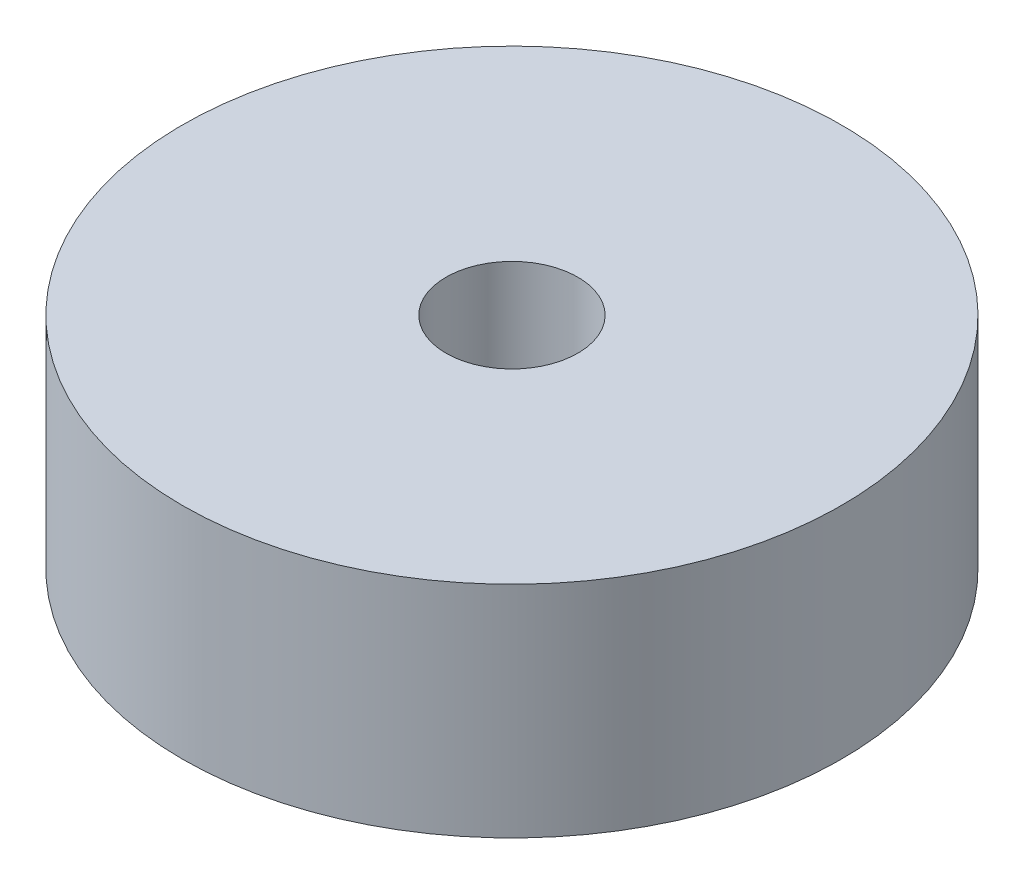
ISO-10303-21;
HEADER;
FILE_DESCRIPTION(('STEP AP214'),'2;1');
FILE_NAME('part.step','',(''),(''),'','','');
FILE_SCHEMA(('AUTOMOTIVE_DESIGN { 1 0 10303 214 1 1 1 1 }'));
ENDSEC;
DATA;
#1=APPLICATION_CONTEXT('core data for automotive mechanical design processes');
#2=APPLICATION_PROTOCOL_DEFINITION('international standard','automotive_design',2000,#1);
#3=PRODUCT_CONTEXT('',#1,'mechanical');
#4=PRODUCT('Part','Part','',(#3));
#5=PRODUCT_RELATED_PRODUCT_CATEGORY('part','',(#4));
#6=PRODUCT_DEFINITION_FORMATION('','',#4);
#7=PRODUCT_DEFINITION_CONTEXT('part definition',#1,'design');
#8=PRODUCT_DEFINITION('design','',#6,#7);
#9=PRODUCT_DEFINITION_SHAPE('','',#8);
#10=(LENGTH_UNIT() NAMED_UNIT(*) SI_UNIT(.MILLI.,.METRE.));
#11=(NAMED_UNIT(*) PLANE_ANGLE_UNIT() SI_UNIT($,.RADIAN.));
#12=(NAMED_UNIT(*) SI_UNIT($,.STERADIAN.) SOLID_ANGLE_UNIT());
#13=UNCERTAINTY_MEASURE_WITH_UNIT(LENGTH_MEASURE(1.E-05),#10,'distance_accuracy_value','');
#14=(GEOMETRIC_REPRESENTATION_CONTEXT(3) GLOBAL_UNCERTAINTY_ASSIGNED_CONTEXT((#13)) GLOBAL_UNIT_ASSIGNED_CONTEXT((#10,
#11,#12)) REPRESENTATION_CONTEXT('',''));
#15=CARTESIAN_POINT('',(0.,0.,0.));
#16=DIRECTION('',(0.,0.,1.));
#17=DIRECTION('',(1.,0.,0.));
#18=AXIS2_PLACEMENT_3D('',#15,#16,#17);
#19=CARTESIAN_POINT('',(0.,10.,0.));
#20=DIRECTION('',(0.,1.,0.));
#21=DIRECTION('',(0.,0.,1.));
#22=AXIS2_PLACEMENT_3D('',#19,#20,#21);
#23=PLANE('',#22);
#24=CARTESIAN_POINT('',(0.,10.,0.));
#25=DIRECTION('',(0.,1.,0.));
#26=DIRECTION('',(0.,0.,1.));
#27=AXIS2_PLACEMENT_3D('',#24,#25,#26);
#28=CIRCLE('',#27,15.);
#29=CARTESIAN_POINT('',(0.,10.,15.));
#30=VERTEX_POINT('',#29);
#31=EDGE_CURVE('E10',#30,#30,#28,.T.);
#32=ORIENTED_EDGE('',*,*,#31,.T.);
#33=EDGE_LOOP('',(#32));
#34=FACE_BOUND('',#33,.T.);
#35=CARTESIAN_POINT('',(0.,10.,0.));
#36=DIRECTION('',(0.,1.,0.));
#37=DIRECTION('',(0.,0.,1.));
#38=AXIS2_PLACEMENT_3D('',#35,#36,#37);
#39=CIRCLE('',#38,3.);
#40=CARTESIAN_POINT('',(0.,10.,3.));
#41=VERTEX_POINT('',#40);
#42=EDGE_CURVE('E41',#41,#41,#39,.T.);
#43=ORIENTED_EDGE('',*,*,#42,.F.);
#44=EDGE_LOOP('',(#43));
#45=FACE_BOUND('',#44,.T.);
#46=ADVANCED_FACE('F30',(#34,#45),#23,.T.);
#47=CARTESIAN_POINT('',(0.,0.,0.));
#48=DIRECTION('',(0.,1.,0.));
#49=DIRECTION('',(0.,0.,1.));
#50=AXIS2_PLACEMENT_3D('',#47,#48,#49);
#51=PLANE('',#50);
#52=CARTESIAN_POINT('',(0.,0.,0.));
#53=DIRECTION('',(0.,1.,0.));
#54=DIRECTION('',(0.,0.,1.));
#55=AXIS2_PLACEMENT_3D('',#52,#53,#54);
#56=CIRCLE('',#55,15.);
#57=CARTESIAN_POINT('',(0.,0.,15.));
#58=VERTEX_POINT('',#57);
#59=EDGE_CURVE('E34',#58,#58,#56,.T.);
#60=ORIENTED_EDGE('',*,*,#59,.F.);
#61=EDGE_LOOP('',(#60));
#62=FACE_BOUND('',#61,.T.);
#63=CARTESIAN_POINT('',(0.,0.,0.));
#64=DIRECTION('',(0.,1.,0.));
#65=DIRECTION('',(0.,0.,1.));
#66=AXIS2_PLACEMENT_3D('',#63,#64,#65);
#67=CIRCLE('',#66,3.);
#68=CARTESIAN_POINT('',(0.,0.,3.));
#69=VERTEX_POINT('',#68);
#70=EDGE_CURVE('E43',#69,#69,#67,.T.);
#71=ORIENTED_EDGE('',*,*,#70,.T.);
#72=EDGE_LOOP('',(#71));
#73=FACE_BOUND('',#72,.T.);
#74=ADVANCED_FACE('F53',(#62,#73),#51,.F.);
#75=CARTESIAN_POINT('',(0.,10.,0.));
#76=DIRECTION('',(0.,-1.,0.));
#77=DIRECTION('',(0.,0.,-1.));
#78=AXIS2_PLACEMENT_3D('',#75,#76,#77);
#79=CYLINDRICAL_SURFACE('',#78,15.);
#80=ORIENTED_EDGE('',*,*,#31,.F.);
#81=EDGE_LOOP('',(#80));
#82=FACE_BOUND('',#81,.T.);
#83=ORIENTED_EDGE('',*,*,#59,.T.);
#84=EDGE_LOOP('',(#83));
#85=FACE_BOUND('',#84,.T.);
#86=ADVANCED_FACE('F32',(#82,#85),#79,.T.);
#87=CARTESIAN_POINT('',(0.,10.,0.));
#88=DIRECTION('',(0.,-1.,0.));
#89=DIRECTION('',(0.,0.,-1.));
#90=AXIS2_PLACEMENT_3D('',#87,#88,#89);
#91=CYLINDRICAL_SURFACE('',#90,3.);
#92=ORIENTED_EDGE('',*,*,#42,.T.);
#93=EDGE_LOOP('',(#92));
#94=FACE_BOUND('',#93,.T.);
#95=ORIENTED_EDGE('',*,*,#70,.F.);
#96=EDGE_LOOP('',(#95));
#97=FACE_BOUND('',#96,.T.);
#98=ADVANCED_FACE('F49',(#94,#97),#91,.F.);
#99=CLOSED_SHELL('',(#46,#74,#86,#98));
#100=MANIFOLD_SOLID_BREP('B2',#99);
#101=ADVANCED_BREP_SHAPE_REPRESENTATION('',(#18,#100),#14);
#102=SHAPE_DEFINITION_REPRESENTATION(#9,#101);
ENDSEC;
END-ISO-10303-21;
